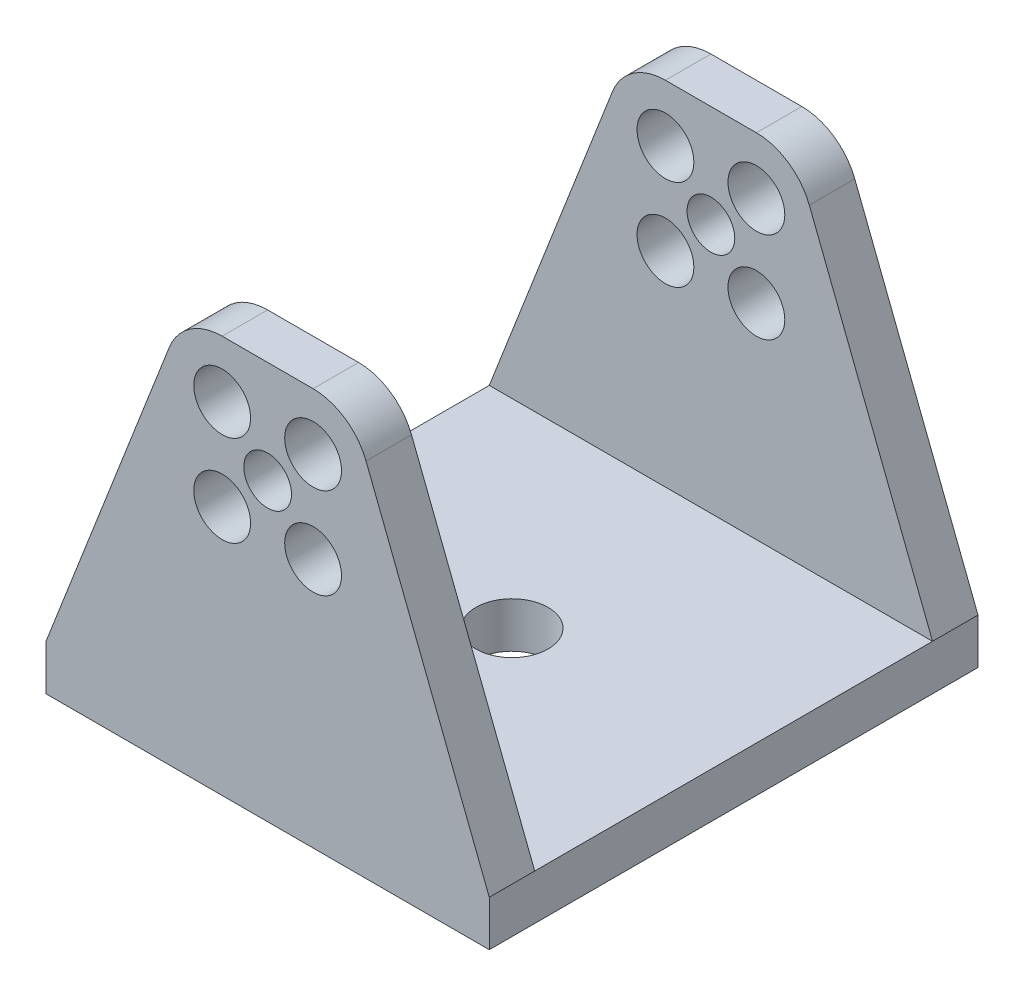
ISO-10303-21;
HEADER;
FILE_DESCRIPTION(('STEP AP214'),'2;1');
FILE_NAME('part.step','',(''),(''),'','','');
FILE_SCHEMA(('AUTOMOTIVE_DESIGN { 1 0 10303 214 1 1 1 1 }'));
ENDSEC;
DATA;
#1=APPLICATION_CONTEXT('core data for automotive mechanical design processes');
#2=APPLICATION_PROTOCOL_DEFINITION('international standard','automotive_design',2000,#1);
#3=PRODUCT_CONTEXT('',#1,'mechanical');
#4=PRODUCT('Part','Part','',(#3));
#5=PRODUCT_RELATED_PRODUCT_CATEGORY('part','',(#4));
#6=PRODUCT_DEFINITION_FORMATION('','',#4);
#7=PRODUCT_DEFINITION_CONTEXT('part definition',#1,'design');
#8=PRODUCT_DEFINITION('design','',#6,#7);
#9=PRODUCT_DEFINITION_SHAPE('','',#8);
#10=(LENGTH_UNIT() NAMED_UNIT(*) SI_UNIT(.MILLI.,.METRE.));
#11=(NAMED_UNIT(*) PLANE_ANGLE_UNIT() SI_UNIT($,.RADIAN.));
#12=(NAMED_UNIT(*) SI_UNIT($,.STERADIAN.) SOLID_ANGLE_UNIT());
#13=UNCERTAINTY_MEASURE_WITH_UNIT(LENGTH_MEASURE(1.E-05),#10,'distance_accuracy_value','');
#14=(GEOMETRIC_REPRESENTATION_CONTEXT(3) GLOBAL_UNCERTAINTY_ASSIGNED_CONTEXT((#13)) GLOBAL_UNIT_ASSIGNED_CONTEXT((#10,
#11,#12)) REPRESENTATION_CONTEXT('',''));
#15=CARTESIAN_POINT('',(0.,0.,0.));
#16=DIRECTION('',(0.,0.,1.));
#17=DIRECTION('',(1.,0.,0.));
#18=AXIS2_PLACEMENT_3D('',#15,#16,#17);
#19=CARTESIAN_POINT('',(23.5,30.,56.8196748283246));
#20=DIRECTION('',(0.,0.,-1.));
#21=DIRECTION('',(-1.,0.,0.));
#22=AXIS2_PLACEMENT_3D('',#19,#20,#21);
#23=CYLINDRICAL_SURFACE('',#22,5.);
#24=CARTESIAN_POINT('',(23.5,30.,-32.));
#25=DIRECTION('',(0.,0.,1.));
#26=DIRECTION('',(1.,0.,0.));
#27=AXIS2_PLACEMENT_3D('',#24,#25,#26);
#28=CIRCLE('',#27,5.);
#29=CARTESIAN_POINT('',(28.1586579667311,31.8157384032435,-32.));
#30=VERTEX_POINT('',#29);
#31=CARTESIAN_POINT('',(23.5,35.,-32.));
#32=VERTEX_POINT('',#31);
#33=EDGE_CURVE('E173',#30,#32,#28,.T.);
#34=ORIENTED_EDGE('',*,*,#33,.F.);
#35=DIRECTION('',(0.,0.,-1.));
#36=VECTOR('',#35,1.);
#37=CARTESIAN_POINT('',(28.1586579667311,31.8157384032435,56.8196748283246));
#38=LINE('',#37,#36);
#39=CARTESIAN_POINT('',(28.1586579667311,31.8157384032435,-36.));
#40=VERTEX_POINT('',#39);
#41=EDGE_CURVE('E172',#30,#40,#38,.T.);
#42=ORIENTED_EDGE('',*,*,#41,.T.);
#43=CARTESIAN_POINT('',(23.5,30.,-36.));
#44=DIRECTION('',(0.,0.,1.));
#45=DIRECTION('',(1.,0.,0.));
#46=AXIS2_PLACEMENT_3D('',#43,#44,#45);
#47=CIRCLE('',#46,5.);
#48=CARTESIAN_POINT('',(23.5,35.,-36.));
#49=VERTEX_POINT('',#48);
#50=EDGE_CURVE('E264',#49,#40,#47,.F.);
#51=ORIENTED_EDGE('',*,*,#50,.F.);
#52=DIRECTION('',(0.,0.,-1.));
#53=VECTOR('',#52,1.);
#54=CARTESIAN_POINT('',(23.5,35.,56.8196748283246));
#55=LINE('',#54,#53);
#56=EDGE_CURVE('E281',#32,#49,#55,.T.);
#57=ORIENTED_EDGE('',*,*,#56,.F.);
#58=EDGE_LOOP('',(#34,#42,#51,#57));
#59=FACE_BOUND('',#58,.T.);
#60=ADVANCED_FACE('F37',(#59),#23,.T.);
#61=CARTESIAN_POINT('',(23.5,30.,3.));
#62=DIRECTION('',(0.,0.,-1.));
#63=DIRECTION('',(-1.,0.,0.));
#64=AXIS2_PLACEMENT_3D('',#61,#62,#63);
#65=CIRCLE('',#64,5.);
#66=CARTESIAN_POINT('',(23.5,35.,3.));
#67=VERTEX_POINT('',#66);
#68=CARTESIAN_POINT('',(28.1586579667311,31.8157384032435,3.));
#69=VERTEX_POINT('',#68);
#70=EDGE_CURVE('E221',#67,#69,#65,.T.);
#71=ORIENTED_EDGE('',*,*,#70,.F.);
#72=CARTESIAN_POINT('',(23.5,35.,7.));
#73=VERTEX_POINT('',#72);
#74=EDGE_CURVE('E277',#73,#67,#55,.T.);
#75=ORIENTED_EDGE('',*,*,#74,.F.);
#76=CARTESIAN_POINT('',(23.5,30.,7.));
#77=DIRECTION('',(0.,0.,-1.));
#78=DIRECTION('',(-1.,0.,0.));
#79=AXIS2_PLACEMENT_3D('',#76,#77,#78);
#80=CIRCLE('',#79,5.);
#81=CARTESIAN_POINT('',(28.1586579667311,31.8157384032435,7.));
#82=VERTEX_POINT('',#81);
#83=EDGE_CURVE('E261',#73,#82,#80,.T.);
#84=ORIENTED_EDGE('',*,*,#83,.T.);
#85=EDGE_CURVE('E292',#82,#69,#38,.T.);
#86=ORIENTED_EDGE('',*,*,#85,.T.);
#87=EDGE_LOOP('',(#71,#75,#84,#86));
#88=FACE_BOUND('',#87,.T.);
#89=ADVANCED_FACE('F342',(#88),#23,.T.);
#90=CARTESIAN_POINT('',(23.5,35.,56.8196748283246));
#91=DIRECTION('',(0.,-1.,0.));
#92=DIRECTION('',(0.,0.,-1.));
#93=AXIS2_PLACEMENT_3D('',#90,#91,#92);
#94=PLANE('',#93);
#95=DIRECTION('',(-1.,0.,0.));
#96=VECTOR('',#95,1.);
#97=CARTESIAN_POINT('',(23.5,35.,-32.));
#98=LINE('',#97,#96);
#99=CARTESIAN_POINT('',(15.5,35.,-32.));
#100=VERTEX_POINT('',#99);
#101=EDGE_CURVE('E241',#32,#100,#98,.T.);
#102=ORIENTED_EDGE('',*,*,#101,.F.);
#103=ORIENTED_EDGE('',*,*,#56,.T.);
#104=DIRECTION('',(1.,0.,0.));
#105=VECTOR('',#104,1.);
#106=CARTESIAN_POINT('',(23.5,35.,-36.));
#107=LINE('',#106,#105);
#108=CARTESIAN_POINT('',(15.5,35.,-36.));
#109=VERTEX_POINT('',#108);
#110=EDGE_CURVE('E258',#109,#49,#107,.T.);
#111=ORIENTED_EDGE('',*,*,#110,.F.);
#112=DIRECTION('',(0.,0.,-1.));
#113=VECTOR('',#112,1.);
#114=CARTESIAN_POINT('',(15.5,35.,56.8196748283246));
#115=LINE('',#114,#113);
#116=EDGE_CURVE('E286',#100,#109,#115,.T.);
#117=ORIENTED_EDGE('',*,*,#116,.F.);
#118=EDGE_LOOP('',(#102,#103,#111,#117));
#119=FACE_BOUND('',#118,.T.);
#120=ADVANCED_FACE('F348',(#119),#94,.F.);
#121=DIRECTION('',(1.,0.,0.));
#122=VECTOR('',#121,1.);
#123=CARTESIAN_POINT('',(23.5,35.,3.));
#124=LINE('',#123,#122);
#125=CARTESIAN_POINT('',(15.5,35.,3.));
#126=VERTEX_POINT('',#125);
#127=EDGE_CURVE('E223',#126,#67,#124,.T.);
#128=ORIENTED_EDGE('',*,*,#127,.F.);
#129=CARTESIAN_POINT('',(15.5,35.,7.));
#130=VERTEX_POINT('',#129);
#131=EDGE_CURVE('E282',#130,#126,#115,.T.);
#132=ORIENTED_EDGE('',*,*,#131,.F.);
#133=DIRECTION('',(1.,0.,0.));
#134=VECTOR('',#133,1.);
#135=CARTESIAN_POINT('',(23.5,35.,7.));
#136=LINE('',#135,#134);
#137=EDGE_CURVE('E295',#130,#73,#136,.T.);
#138=ORIENTED_EDGE('',*,*,#137,.T.);
#139=ORIENTED_EDGE('',*,*,#74,.T.);
#140=EDGE_LOOP('',(#128,#132,#138,#139));
#141=FACE_BOUND('',#140,.T.);
#142=ADVANCED_FACE('F410',(#141),#94,.F.);
#143=CARTESIAN_POINT('',(15.5,30.,56.8196748283246));
#144=DIRECTION('',(0.,0.,-1.));
#145=DIRECTION('',(-1.,0.,0.));
#146=AXIS2_PLACEMENT_3D('',#143,#144,#145);
#147=CYLINDRICAL_SURFACE('',#146,5.);
#148=CARTESIAN_POINT('',(15.5,30.,-32.));
#149=DIRECTION('',(0.,0.,1.));
#150=DIRECTION('',(1.,0.,0.));
#151=AXIS2_PLACEMENT_3D('',#148,#149,#150);
#152=CIRCLE('',#151,5.);
#153=CARTESIAN_POINT('',(10.841342033269,31.8157384032435,-32.));
#154=VERTEX_POINT('',#153);
#155=EDGE_CURVE('E243',#100,#154,#152,.T.);
#156=ORIENTED_EDGE('',*,*,#155,.F.);
#157=ORIENTED_EDGE('',*,*,#116,.T.);
#158=CARTESIAN_POINT('',(15.5,30.,-36.));
#159=DIRECTION('',(0.,0.,1.));
#160=DIRECTION('',(1.,0.,0.));
#161=AXIS2_PLACEMENT_3D('',#158,#159,#160);
#162=CIRCLE('',#161,5.);
#163=CARTESIAN_POINT('',(10.841342033269,31.8157384032435,-36.));
#164=VERTEX_POINT('',#163);
#165=EDGE_CURVE('E265',#164,#109,#162,.F.);
#166=ORIENTED_EDGE('',*,*,#165,.F.);
#167=DIRECTION('',(0.,0.,-1.));
#168=VECTOR('',#167,1.);
#169=CARTESIAN_POINT('',(10.841342033269,31.8157384032435,56.8196748283246));
#170=LINE('',#169,#168);
#171=EDGE_CURVE('E291',#154,#164,#170,.T.);
#172=ORIENTED_EDGE('',*,*,#171,.F.);
#173=EDGE_LOOP('',(#156,#157,#166,#172));
#174=FACE_BOUND('',#173,.T.);
#175=ADVANCED_FACE('F408',(#174),#147,.T.);
#176=CARTESIAN_POINT('',(15.5,30.,3.));
#177=DIRECTION('',(0.,0.,-1.));
#178=DIRECTION('',(-1.,0.,0.));
#179=AXIS2_PLACEMENT_3D('',#176,#177,#178);
#180=CIRCLE('',#179,5.);
#181=CARTESIAN_POINT('',(10.841342033269,31.8157384032435,3.));
#182=VERTEX_POINT('',#181);
#183=EDGE_CURVE('E225',#182,#126,#180,.T.);
#184=ORIENTED_EDGE('',*,*,#183,.F.);
#185=CARTESIAN_POINT('',(10.841342033269,31.8157384032435,7.));
#186=VERTEX_POINT('',#185);
#187=EDGE_CURVE('E287',#186,#182,#170,.T.);
#188=ORIENTED_EDGE('',*,*,#187,.F.);
#189=CARTESIAN_POINT('',(15.5,30.,7.));
#190=DIRECTION('',(0.,0.,-1.));
#191=DIRECTION('',(-1.,0.,0.));
#192=AXIS2_PLACEMENT_3D('',#189,#190,#191);
#193=CIRCLE('',#192,5.);
#194=EDGE_CURVE('E280',#186,#130,#193,.T.);
#195=ORIENTED_EDGE('',*,*,#194,.T.);
#196=ORIENTED_EDGE('',*,*,#131,.T.);
#197=EDGE_LOOP('',(#184,#188,#195,#196));
#198=FACE_BOUND('',#197,.T.);
#199=ADVANCED_FACE('F406',(#198),#147,.T.);
#200=CARTESIAN_POINT('',(0.,4.,56.8196748283246));
#201=DIRECTION('',(0.93173159334621,-0.363147680648703,0.));
#202=DIRECTION('',(0.363147680648703,0.93173159334621,0.));
#203=AXIS2_PLACEMENT_3D('',#200,#201,#202);
#204=PLANE('',#203);
#205=DIRECTION('',(-0.363147680648703,-0.93173159334621,0.));
#206=VECTOR('',#205,1.);
#207=CARTESIAN_POINT('',(0.,4.,-32.));
#208=LINE('',#207,#206);
#209=CARTESIAN_POINT('',(0.,4.,-32.));
#210=VERTEX_POINT('',#209);
#211=EDGE_CURVE('E168',#154,#210,#208,.T.);
#212=ORIENTED_EDGE('',*,*,#211,.F.);
#213=ORIENTED_EDGE('',*,*,#171,.T.);
#214=DIRECTION('',(0.363147680648703,0.93173159334621,0.));
#215=VECTOR('',#214,1.);
#216=CARTESIAN_POINT('',(0.,4.,-36.));
#217=LINE('',#216,#215);
#218=CARTESIAN_POINT('',(0.,4.,-36.));
#219=VERTEX_POINT('',#218);
#220=EDGE_CURVE('E268',#219,#164,#217,.T.);
#221=ORIENTED_EDGE('',*,*,#220,.F.);
#222=DIRECTION('',(0.,0.,1.));
#223=VECTOR('',#222,1.);
#224=CARTESIAN_POINT('',(0.,4.,-36.));
#225=LINE('',#224,#223);
#226=EDGE_CURVE('E180',#219,#210,#225,.T.);
#227=ORIENTED_EDGE('',*,*,#226,.T.);
#228=EDGE_LOOP('',(#212,#213,#221,#227));
#229=FACE_BOUND('',#228,.T.);
#230=ADVANCED_FACE('F404',(#229),#204,.F.);
#231=DIRECTION('',(0.363147680648703,0.93173159334621,0.));
#232=VECTOR('',#231,1.);
#233=CARTESIAN_POINT('',(0.,4.,3.));
#234=LINE('',#233,#232);
#235=CARTESIAN_POINT('',(0.,4.,3.));
#236=VERTEX_POINT('',#235);
#237=EDGE_CURVE('E227',#236,#182,#234,.T.);
#238=ORIENTED_EDGE('',*,*,#237,.F.);
#239=CARTESIAN_POINT('',(0.,4.,7.));
#240=VERTEX_POINT('',#239);
#241=EDGE_CURVE('E92',#236,#240,#225,.T.);
#242=ORIENTED_EDGE('',*,*,#241,.T.);
#243=DIRECTION('',(0.363147680648703,0.93173159334621,0.));
#244=VECTOR('',#243,1.);
#245=CARTESIAN_POINT('',(0.,4.,7.));
#246=LINE('',#245,#244);
#247=EDGE_CURVE('E285',#240,#186,#246,.T.);
#248=ORIENTED_EDGE('',*,*,#247,.T.);
#249=ORIENTED_EDGE('',*,*,#187,.T.);
#250=EDGE_LOOP('',(#238,#242,#248,#249));
#251=FACE_BOUND('',#250,.T.);
#252=ADVANCED_FACE('F403',(#251),#204,.F.);
#253=CARTESIAN_POINT('',(39.,4.,56.8196748283246));
#254=DIRECTION('',(-0.93173159334621,-0.363147680648702,0.));
#255=DIRECTION('',(0.363147680648703,-0.93173159334621,0.));
#256=AXIS2_PLACEMENT_3D('',#253,#254,#255);
#257=PLANE('',#256);
#258=DIRECTION('',(-0.363147680648703,0.93173159334621,0.));
#259=VECTOR('',#258,1.);
#260=CARTESIAN_POINT('',(39.,4.,-32.));
#261=LINE('',#260,#259);
#262=CARTESIAN_POINT('',(39.,4.,-32.));
#263=VERTEX_POINT('',#262);
#264=EDGE_CURVE('E165',#263,#30,#261,.T.);
#265=ORIENTED_EDGE('',*,*,#264,.F.);
#266=DIRECTION('',(0.,0.,-1.));
#267=VECTOR('',#266,1.);
#268=CARTESIAN_POINT('',(39.,4.,-36.));
#269=LINE('',#268,#267);
#270=CARTESIAN_POINT('',(39.,4.,-36.));
#271=VERTEX_POINT('',#270);
#272=EDGE_CURVE('E63',#263,#271,#269,.T.);
#273=ORIENTED_EDGE('',*,*,#272,.T.);
#274=DIRECTION('',(0.363147680648702,-0.93173159334621,0.));
#275=VECTOR('',#274,1.);
#276=CARTESIAN_POINT('',(39.,4.,-36.));
#277=LINE('',#276,#275);
#278=EDGE_CURVE('E271',#40,#271,#277,.T.);
#279=ORIENTED_EDGE('',*,*,#278,.F.);
#280=ORIENTED_EDGE('',*,*,#41,.F.);
#281=EDGE_LOOP('',(#265,#273,#279,#280));
#282=FACE_BOUND('',#281,.T.);
#283=ADVANCED_FACE('F171',(#282),#257,.F.);
#284=DIRECTION('',(0.363147680648703,-0.93173159334621,0.));
#285=VECTOR('',#284,1.);
#286=CARTESIAN_POINT('',(39.,4.,3.));
#287=LINE('',#286,#285);
#288=CARTESIAN_POINT('',(39.,4.,3.));
#289=VERTEX_POINT('',#288);
#290=EDGE_CURVE('E219',#69,#289,#287,.T.);
#291=ORIENTED_EDGE('',*,*,#290,.F.);
#292=ORIENTED_EDGE('',*,*,#85,.F.);
#293=DIRECTION('',(0.363147680648703,-0.93173159334621,0.));
#294=VECTOR('',#293,1.);
#295=CARTESIAN_POINT('',(39.,4.,7.));
#296=LINE('',#295,#294);
#297=CARTESIAN_POINT('',(39.,4.,7.));
#298=VERTEX_POINT('',#297);
#299=EDGE_CURVE('E290',#82,#298,#296,.T.);
#300=ORIENTED_EDGE('',*,*,#299,.T.);
#301=EDGE_CURVE('E179',#298,#289,#269,.T.);
#302=ORIENTED_EDGE('',*,*,#301,.T.);
#303=EDGE_LOOP('',(#291,#292,#300,#302));
#304=FACE_BOUND('',#303,.T.);
#305=ADVANCED_FACE('F389',(#304),#257,.F.);
#306=CARTESIAN_POINT('',(15.5,30.,56.8196748283246));
#307=DIRECTION('',(0.,0.,-1.));
#308=DIRECTION('',(-1.,0.,0.));
#309=AXIS2_PLACEMENT_3D('',#306,#307,#308);
#310=CYLINDRICAL_SURFACE('',#309,2.5);
#311=CARTESIAN_POINT('',(15.5,30.,-36.));
#312=DIRECTION('',(0.,0.,1.));
#313=DIRECTION('',(1.,0.,0.));
#314=AXIS2_PLACEMENT_3D('',#311,#312,#313);
#315=CIRCLE('',#314,2.5);
#316=CARTESIAN_POINT('',(18.,30.,-36.));
#317=VERTEX_POINT('',#316);
#318=EDGE_CURVE('E255',#317,#317,#315,.F.);
#319=ORIENTED_EDGE('',*,*,#318,.T.);
#320=EDGE_LOOP('',(#319));
#321=FACE_BOUND('',#320,.T.);
#322=CARTESIAN_POINT('',(15.5,30.,-32.));
#323=DIRECTION('',(0.,0.,1.));
#324=DIRECTION('',(1.,0.,0.));
#325=AXIS2_PLACEMENT_3D('',#322,#323,#324);
#326=CIRCLE('',#325,2.5);
#327=CARTESIAN_POINT('',(18.,30.,-32.));
#328=VERTEX_POINT('',#327);
#329=EDGE_CURVE('E174',#328,#328,#326,.T.);
#330=ORIENTED_EDGE('',*,*,#329,.T.);
#331=EDGE_LOOP('',(#330));
#332=FACE_BOUND('',#331,.T.);
#333=ADVANCED_FACE('F387',(#321,#332),#310,.F.);
#334=CARTESIAN_POINT('',(15.5,30.,7.));
#335=DIRECTION('',(0.,0.,-1.));
#336=DIRECTION('',(-1.,0.,0.));
#337=AXIS2_PLACEMENT_3D('',#334,#335,#336);
#338=CIRCLE('',#337,2.5);
#339=CARTESIAN_POINT('',(13.,30.,7.));
#340=VERTEX_POINT('',#339);
#341=EDGE_CURVE('E306',#340,#340,#338,.T.);
#342=ORIENTED_EDGE('',*,*,#341,.F.);
#343=EDGE_LOOP('',(#342));
#344=FACE_BOUND('',#343,.T.);
#345=CARTESIAN_POINT('',(15.5,30.,3.));
#346=DIRECTION('',(0.,0.,-1.));
#347=DIRECTION('',(-1.,0.,0.));
#348=AXIS2_PLACEMENT_3D('',#345,#346,#347);
#349=CIRCLE('',#348,2.5);
#350=CARTESIAN_POINT('',(13.,30.,3.));
#351=VERTEX_POINT('',#350);
#352=EDGE_CURVE('E216',#351,#351,#349,.T.);
#353=ORIENTED_EDGE('',*,*,#352,.T.);
#354=EDGE_LOOP('',(#353));
#355=FACE_BOUND('',#354,.T.);
#356=ADVANCED_FACE('F357',(#344,#355),#310,.F.);
#357=CARTESIAN_POINT('',(19.5,26.,56.8196748283246));
#358=DIRECTION('',(0.,0.,-1.));
#359=DIRECTION('',(-1.,0.,0.));
#360=AXIS2_PLACEMENT_3D('',#357,#358,#359);
#361=CYLINDRICAL_SURFACE('',#360,2.1);
#362=CARTESIAN_POINT('',(19.5,26.,-36.));
#363=DIRECTION('',(0.,0.,1.));
#364=DIRECTION('',(1.,0.,0.));
#365=AXIS2_PLACEMENT_3D('',#362,#363,#364);
#366=CIRCLE('',#365,2.1);
#367=CARTESIAN_POINT('',(21.6,26.,-36.));
#368=VERTEX_POINT('',#367);
#369=EDGE_CURVE('E251',#368,#368,#366,.F.);
#370=ORIENTED_EDGE('',*,*,#369,.T.);
#371=EDGE_LOOP('',(#370));
#372=FACE_BOUND('',#371,.T.);
#373=CARTESIAN_POINT('',(19.5,26.,-32.));
#374=DIRECTION('',(0.,0.,1.));
#375=DIRECTION('',(1.,0.,0.));
#376=AXIS2_PLACEMENT_3D('',#373,#374,#375);
#377=CIRCLE('',#376,2.1);
#378=CARTESIAN_POINT('',(21.6,26.,-32.));
#379=VERTEX_POINT('',#378);
#380=EDGE_CURVE('E235',#379,#379,#377,.T.);
#381=ORIENTED_EDGE('',*,*,#380,.T.);
#382=EDGE_LOOP('',(#381));
#383=FACE_BOUND('',#382,.T.);
#384=ADVANCED_FACE('F353',(#372,#383),#361,.F.);
#385=CARTESIAN_POINT('',(19.5,26.,7.));
#386=DIRECTION('',(0.,0.,-1.));
#387=DIRECTION('',(-1.,0.,0.));
#388=AXIS2_PLACEMENT_3D('',#385,#386,#387);
#389=CIRCLE('',#388,2.1);
#390=CARTESIAN_POINT('',(17.4,26.,7.));
#391=VERTEX_POINT('',#390);
#392=EDGE_CURVE('E309',#391,#391,#389,.T.);
#393=ORIENTED_EDGE('',*,*,#392,.F.);
#394=EDGE_LOOP('',(#393));
#395=FACE_BOUND('',#394,.T.);
#396=CARTESIAN_POINT('',(19.5,26.,3.));
#397=DIRECTION('',(0.,0.,-1.));
#398=DIRECTION('',(-1.,0.,0.));
#399=AXIS2_PLACEMENT_3D('',#396,#397,#398);
#400=CIRCLE('',#399,2.1);
#401=CARTESIAN_POINT('',(17.4,26.,3.));
#402=VERTEX_POINT('',#401);
#403=EDGE_CURVE('E213',#402,#402,#400,.T.);
#404=ORIENTED_EDGE('',*,*,#403,.T.);
#405=EDGE_LOOP('',(#404));
#406=FACE_BOUND('',#405,.T.);
#407=ADVANCED_FACE('F356',(#395,#406),#361,.F.);
#408=CARTESIAN_POINT('',(23.5,30.,56.8196748283246));
#409=DIRECTION('',(0.,0.,-1.));
#410=DIRECTION('',(-1.,0.,0.));
#411=AXIS2_PLACEMENT_3D('',#408,#409,#410);
#412=CYLINDRICAL_SURFACE('',#411,2.5);
#413=CARTESIAN_POINT('',(23.5,30.,-36.));
#414=DIRECTION('',(0.,0.,1.));
#415=DIRECTION('',(1.,0.,0.));
#416=AXIS2_PLACEMENT_3D('',#413,#414,#415);
#417=CIRCLE('',#416,2.5);
#418=CARTESIAN_POINT('',(26.,30.,-36.));
#419=VERTEX_POINT('',#418);
#420=EDGE_CURVE('E252',#419,#419,#417,.F.);
#421=ORIENTED_EDGE('',*,*,#420,.T.);
#422=EDGE_LOOP('',(#421));
#423=FACE_BOUND('',#422,.T.);
#424=CARTESIAN_POINT('',(23.5,30.,-32.));
#425=DIRECTION('',(0.,0.,1.));
#426=DIRECTION('',(1.,0.,0.));
#427=AXIS2_PLACEMENT_3D('',#424,#425,#426);
#428=CIRCLE('',#427,2.5);
#429=CARTESIAN_POINT('',(26.,30.,-32.));
#430=VERTEX_POINT('',#429);
#431=EDGE_CURVE('E232',#430,#430,#428,.T.);
#432=ORIENTED_EDGE('',*,*,#431,.T.);
#433=EDGE_LOOP('',(#432));
#434=FACE_BOUND('',#433,.T.);
#435=ADVANCED_FACE('F400',(#423,#434),#412,.F.);
#436=CARTESIAN_POINT('',(23.5,30.,7.));
#437=DIRECTION('',(0.,0.,-1.));
#438=DIRECTION('',(-1.,0.,0.));
#439=AXIS2_PLACEMENT_3D('',#436,#437,#438);
#440=CIRCLE('',#439,2.5);
#441=CARTESIAN_POINT('',(21.,30.,7.));
#442=VERTEX_POINT('',#441);
#443=EDGE_CURVE('E312',#442,#442,#440,.T.);
#444=ORIENTED_EDGE('',*,*,#443,.F.);
#445=EDGE_LOOP('',(#444));
#446=FACE_BOUND('',#445,.T.);
#447=CARTESIAN_POINT('',(23.5,30.,3.));
#448=DIRECTION('',(0.,0.,-1.));
#449=DIRECTION('',(-1.,0.,0.));
#450=AXIS2_PLACEMENT_3D('',#447,#448,#449);
#451=CIRCLE('',#450,2.5);
#452=CARTESIAN_POINT('',(21.,30.,3.));
#453=VERTEX_POINT('',#452);
#454=EDGE_CURVE('E205',#453,#453,#451,.T.);
#455=ORIENTED_EDGE('',*,*,#454,.T.);
#456=EDGE_LOOP('',(#455));
#457=FACE_BOUND('',#456,.T.);
#458=ADVANCED_FACE('F362',(#446,#457),#412,.F.);
#459=CARTESIAN_POINT('',(23.5000000000001,22.,56.8196748283246));
#460=DIRECTION('',(0.,0.,-1.));
#461=DIRECTION('',(-1.,0.,0.));
#462=AXIS2_PLACEMENT_3D('',#459,#460,#461);
#463=CYLINDRICAL_SURFACE('',#462,2.5);
#464=CARTESIAN_POINT('',(23.5000000000001,22.,-36.));
#465=DIRECTION('',(0.,0.,1.));
#466=DIRECTION('',(1.,0.,0.));
#467=AXIS2_PLACEMENT_3D('',#464,#465,#466);
#468=CIRCLE('',#467,2.5);
#469=CARTESIAN_POINT('',(26.0000000000001,22.,-36.));
#470=VERTEX_POINT('',#469);
#471=EDGE_CURVE('E247',#470,#470,#468,.F.);
#472=ORIENTED_EDGE('',*,*,#471,.T.);
#473=EDGE_LOOP('',(#472));
#474=FACE_BOUND('',#473,.T.);
#475=CARTESIAN_POINT('',(23.5000000000001,22.,-32.));
#476=DIRECTION('',(0.,0.,1.));
#477=DIRECTION('',(1.,0.,0.));
#478=AXIS2_PLACEMENT_3D('',#475,#476,#477);
#479=CIRCLE('',#478,2.5);
#480=CARTESIAN_POINT('',(26.0000000000001,22.,-32.));
#481=VERTEX_POINT('',#480);
#482=EDGE_CURVE('E229',#481,#481,#479,.T.);
#483=ORIENTED_EDGE('',*,*,#482,.T.);
#484=EDGE_LOOP('',(#483));
#485=FACE_BOUND('',#484,.T.);
#486=ADVANCED_FACE('F359',(#474,#485),#463,.F.);
#487=CARTESIAN_POINT('',(23.5000000000001,22.,7.));
#488=DIRECTION('',(0.,0.,-1.));
#489=DIRECTION('',(-1.,0.,0.));
#490=AXIS2_PLACEMENT_3D('',#487,#488,#489);
#491=CIRCLE('',#490,2.5);
#492=CARTESIAN_POINT('',(21.0000000000001,22.,7.));
#493=VERTEX_POINT('',#492);
#494=EDGE_CURVE('E315',#493,#493,#491,.T.);
#495=ORIENTED_EDGE('',*,*,#494,.F.);
#496=EDGE_LOOP('',(#495));
#497=FACE_BOUND('',#496,.T.);
#498=CARTESIAN_POINT('',(23.5000000000001,22.,3.));
#499=DIRECTION('',(0.,0.,-1.));
#500=DIRECTION('',(-1.,0.,0.));
#501=AXIS2_PLACEMENT_3D('',#498,#499,#500);
#502=CIRCLE('',#501,2.5);
#503=CARTESIAN_POINT('',(21.0000000000001,22.,3.));
#504=VERTEX_POINT('',#503);
#505=EDGE_CURVE('E201',#504,#504,#502,.T.);
#506=ORIENTED_EDGE('',*,*,#505,.T.);
#507=EDGE_LOOP('',(#506));
#508=FACE_BOUND('',#507,.T.);
#509=ADVANCED_FACE('F361',(#497,#508),#463,.F.);
#510=CARTESIAN_POINT('',(15.5000000000001,22.,56.8196748283246));
#511=DIRECTION('',(0.,0.,-1.));
#512=DIRECTION('',(-1.,0.,0.));
#513=AXIS2_PLACEMENT_3D('',#510,#511,#512);
#514=CYLINDRICAL_SURFACE('',#513,2.5);
#515=CARTESIAN_POINT('',(15.5000000000001,22.,-36.));
#516=DIRECTION('',(0.,0.,1.));
#517=DIRECTION('',(1.,0.,0.));
#518=AXIS2_PLACEMENT_3D('',#515,#516,#517);
#519=CIRCLE('',#518,2.5);
#520=CARTESIAN_POINT('',(18.0000000000001,22.,-36.));
#521=VERTEX_POINT('',#520);
#522=EDGE_CURVE('E250',#521,#521,#519,.F.);
#523=ORIENTED_EDGE('',*,*,#522,.T.);
#524=EDGE_LOOP('',(#523));
#525=FACE_BOUND('',#524,.T.);
#526=CARTESIAN_POINT('',(15.5000000000001,22.,-32.));
#527=DIRECTION('',(0.,0.,1.));
#528=DIRECTION('',(1.,0.,0.));
#529=AXIS2_PLACEMENT_3D('',#526,#527,#528);
#530=CIRCLE('',#529,2.5);
#531=CARTESIAN_POINT('',(18.0000000000001,22.,-32.));
#532=VERTEX_POINT('',#531);
#533=EDGE_CURVE('E41',#532,#532,#530,.T.);
#534=ORIENTED_EDGE('',*,*,#533,.T.);
#535=EDGE_LOOP('',(#534));
#536=FACE_BOUND('',#535,.T.);
#537=ADVANCED_FACE('F364',(#525,#536),#514,.F.);
#538=CARTESIAN_POINT('',(15.5000000000001,22.,7.));
#539=DIRECTION('',(0.,0.,-1.));
#540=DIRECTION('',(-1.,0.,0.));
#541=AXIS2_PLACEMENT_3D('',#538,#539,#540);
#542=CIRCLE('',#541,2.5);
#543=CARTESIAN_POINT('',(13.0000000000001,22.,7.));
#544=VERTEX_POINT('',#543);
#545=EDGE_CURVE('E305',#544,#544,#542,.T.);
#546=ORIENTED_EDGE('',*,*,#545,.F.);
#547=EDGE_LOOP('',(#546));
#548=FACE_BOUND('',#547,.T.);
#549=CARTESIAN_POINT('',(15.5000000000001,22.,3.));
#550=DIRECTION('',(0.,0.,-1.));
#551=DIRECTION('',(-1.,0.,0.));
#552=AXIS2_PLACEMENT_3D('',#549,#550,#551);
#553=CIRCLE('',#552,2.5);
#554=CARTESIAN_POINT('',(13.0000000000001,22.,3.));
#555=VERTEX_POINT('',#554);
#556=EDGE_CURVE('E199',#555,#555,#553,.T.);
#557=ORIENTED_EDGE('',*,*,#556,.T.);
#558=EDGE_LOOP('',(#557));
#559=FACE_BOUND('',#558,.T.);
#560=ADVANCED_FACE('F366',(#548,#559),#514,.F.);
#561=CARTESIAN_POINT('',(0.,0.,0.));
#562=DIRECTION('',(0.,1.,0.));
#563=DIRECTION('',(0.,0.,1.));
#564=AXIS2_PLACEMENT_3D('',#561,#562,#563);
#565=PLANE('',#564);
#566=DIRECTION('',(0.,0.,1.));
#567=VECTOR('',#566,1.);
#568=CARTESIAN_POINT('',(0.,0.,-36.));
#569=LINE('',#568,#567);
#570=CARTESIAN_POINT('',(0.,0.,-36.));
#571=VERTEX_POINT('',#570);
#572=CARTESIAN_POINT('',(0.,0.,7.));
#573=VERTEX_POINT('',#572);
#574=EDGE_CURVE('E187',#571,#573,#569,.T.);
#575=ORIENTED_EDGE('',*,*,#574,.F.);
#576=DIRECTION('',(-1.,0.,0.));
#577=VECTOR('',#576,1.);
#578=CARTESIAN_POINT('',(0.,0.,-36.));
#579=LINE('',#578,#577);
#580=CARTESIAN_POINT('',(39.,0.,-36.));
#581=VERTEX_POINT('',#580);
#582=EDGE_CURVE('E85',#581,#571,#579,.T.);
#583=ORIENTED_EDGE('',*,*,#582,.F.);
#584=DIRECTION('',(0.,0.,-1.));
#585=VECTOR('',#584,1.);
#586=CARTESIAN_POINT('',(39.,0.,-36.));
#587=LINE('',#586,#585);
#588=CARTESIAN_POINT('',(39.,0.,7.));
#589=VERTEX_POINT('',#588);
#590=EDGE_CURVE('E193',#589,#581,#587,.T.);
#591=ORIENTED_EDGE('',*,*,#590,.F.);
#592=DIRECTION('',(1.,0.,0.));
#593=VECTOR('',#592,1.);
#594=CARTESIAN_POINT('',(0.,0.,7.));
#595=LINE('',#594,#593);
#596=EDGE_CURVE('E190',#573,#589,#595,.T.);
#597=ORIENTED_EDGE('',*,*,#596,.F.);
#598=EDGE_LOOP('',(#575,#583,#591,#597));
#599=FACE_BOUND('',#598,.T.);
#600=CARTESIAN_POINT('',(19.5,0.,-14.5));
#601=DIRECTION('',(0.,1.,0.));
#602=DIRECTION('',(0.,0.,1.));
#603=AXIS2_PLACEMENT_3D('',#600,#601,#602);
#604=CIRCLE('',#603,3.175);
#605=CARTESIAN_POINT('',(19.5,0.,-11.325));
#606=VERTEX_POINT('',#605);
#607=EDGE_CURVE('E191',#606,#606,#604,.T.);
#608=ORIENTED_EDGE('',*,*,#607,.T.);
#609=EDGE_LOOP('',(#608));
#610=FACE_BOUND('',#609,.T.);
#611=ADVANCED_FACE('F324',(#599,#610),#565,.F.);
#612=CARTESIAN_POINT('',(0.,4.,-36.));
#613=DIRECTION('',(1.,0.,0.));
#614=DIRECTION('',(0.,0.,-1.));
#615=AXIS2_PLACEMENT_3D('',#612,#613,#614);
#616=PLANE('',#615);
#617=ORIENTED_EDGE('',*,*,#574,.T.);
#618=DIRECTION('',(0.,-1.,0.));
#619=VECTOR('',#618,1.);
#620=CARTESIAN_POINT('',(0.,4.,7.));
#621=LINE('',#620,#619);
#622=EDGE_CURVE('E11',#240,#573,#621,.T.);
#623=ORIENTED_EDGE('',*,*,#622,.F.);
#624=ORIENTED_EDGE('',*,*,#241,.F.);
#625=DIRECTION('',(0.,0.,-1.));
#626=VECTOR('',#625,1.);
#627=CARTESIAN_POINT('',(0.,4.,-32.));
#628=LINE('',#627,#626);
#629=EDGE_CURVE('E161',#236,#210,#628,.T.);
#630=ORIENTED_EDGE('',*,*,#629,.T.);
#631=ORIENTED_EDGE('',*,*,#226,.F.);
#632=DIRECTION('',(0.,-1.,0.));
#633=VECTOR('',#632,1.);
#634=CARTESIAN_POINT('',(0.,4.,-36.));
#635=LINE('',#634,#633);
#636=EDGE_CURVE('E182',#219,#571,#635,.T.);
#637=ORIENTED_EDGE('',*,*,#636,.T.);
#638=EDGE_LOOP('',(#617,#623,#624,#630,#631,#637));
#639=FACE_BOUND('',#638,.T.);
#640=ADVANCED_FACE('F39',(#639),#616,.F.);
#641=CARTESIAN_POINT('',(0.,4.,7.));
#642=DIRECTION('',(0.,0.,-1.));
#643=DIRECTION('',(-1.,0.,0.));
#644=AXIS2_PLACEMENT_3D('',#641,#642,#643);
#645=PLANE('',#644);
#646=ORIENTED_EDGE('',*,*,#596,.T.);
#647=DIRECTION('',(0.,-1.,0.));
#648=VECTOR('',#647,1.);
#649=CARTESIAN_POINT('',(39.,4.,7.));
#650=LINE('',#649,#648);
#651=EDGE_CURVE('E46',#298,#589,#650,.T.);
#652=ORIENTED_EDGE('',*,*,#651,.F.);
#653=ORIENTED_EDGE('',*,*,#299,.F.);
#654=ORIENTED_EDGE('',*,*,#83,.F.);
#655=ORIENTED_EDGE('',*,*,#137,.F.);
#656=ORIENTED_EDGE('',*,*,#194,.F.);
#657=ORIENTED_EDGE('',*,*,#247,.F.);
#658=ORIENTED_EDGE('',*,*,#622,.T.);
#659=EDGE_LOOP('',(#646,#652,#653,#654,#655,#656,#657,#658));
#660=FACE_BOUND('',#659,.T.);
#661=ORIENTED_EDGE('',*,*,#545,.T.);
#662=EDGE_LOOP('',(#661));
#663=FACE_BOUND('',#662,.T.);
#664=ORIENTED_EDGE('',*,*,#494,.T.);
#665=EDGE_LOOP('',(#664));
#666=FACE_BOUND('',#665,.T.);
#667=ORIENTED_EDGE('',*,*,#443,.T.);
#668=EDGE_LOOP('',(#667));
#669=FACE_BOUND('',#668,.T.);
#670=ORIENTED_EDGE('',*,*,#392,.T.);
#671=EDGE_LOOP('',(#670));
#672=FACE_BOUND('',#671,.T.);
#673=ORIENTED_EDGE('',*,*,#341,.T.);
#674=EDGE_LOOP('',(#673));
#675=FACE_BOUND('',#674,.T.);
#676=ADVANCED_FACE('F443',(#660,#663,#666,#669,#672,#675),#645,.F.);
#677=CARTESIAN_POINT('',(39.,4.,-36.));
#678=DIRECTION('',(-1.,0.,0.));
#679=DIRECTION('',(0.,0.,1.));
#680=AXIS2_PLACEMENT_3D('',#677,#678,#679);
#681=PLANE('',#680);
#682=ORIENTED_EDGE('',*,*,#590,.T.);
#683=DIRECTION('',(0.,-1.,0.));
#684=VECTOR('',#683,1.);
#685=CARTESIAN_POINT('',(39.,4.,-36.));
#686=LINE('',#685,#684);
#687=EDGE_CURVE('E177',#271,#581,#686,.T.);
#688=ORIENTED_EDGE('',*,*,#687,.F.);
#689=ORIENTED_EDGE('',*,*,#272,.F.);
#690=DIRECTION('',(0.,0.,-1.));
#691=VECTOR('',#690,1.);
#692=CARTESIAN_POINT('',(39.,4.,-32.));
#693=LINE('',#692,#691);
#694=EDGE_CURVE('E153',#289,#263,#693,.T.);
#695=ORIENTED_EDGE('',*,*,#694,.F.);
#696=ORIENTED_EDGE('',*,*,#301,.F.);
#697=ORIENTED_EDGE('',*,*,#651,.T.);
#698=EDGE_LOOP('',(#682,#688,#689,#695,#696,#697));
#699=FACE_BOUND('',#698,.T.);
#700=ADVANCED_FACE('F176',(#699),#681,.F.);
#701=CARTESIAN_POINT('',(0.,4.,-36.));
#702=DIRECTION('',(0.,0.,1.));
#703=DIRECTION('',(1.,0.,0.));
#704=AXIS2_PLACEMENT_3D('',#701,#702,#703);
#705=PLANE('',#704);
#706=ORIENTED_EDGE('',*,*,#582,.T.);
#707=ORIENTED_EDGE('',*,*,#636,.F.);
#708=ORIENTED_EDGE('',*,*,#220,.T.);
#709=ORIENTED_EDGE('',*,*,#165,.T.);
#710=ORIENTED_EDGE('',*,*,#110,.T.);
#711=ORIENTED_EDGE('',*,*,#50,.T.);
#712=ORIENTED_EDGE('',*,*,#278,.T.);
#713=ORIENTED_EDGE('',*,*,#687,.T.);
#714=EDGE_LOOP('',(#706,#707,#708,#709,#710,#711,#712,#713));
#715=FACE_BOUND('',#714,.T.);
#716=ORIENTED_EDGE('',*,*,#369,.F.);
#717=EDGE_LOOP('',(#716));
#718=FACE_BOUND('',#717,.T.);
#719=ORIENTED_EDGE('',*,*,#471,.F.);
#720=EDGE_LOOP('',(#719));
#721=FACE_BOUND('',#720,.T.);
#722=ORIENTED_EDGE('',*,*,#522,.F.);
#723=EDGE_LOOP('',(#722));
#724=FACE_BOUND('',#723,.T.);
#725=ORIENTED_EDGE('',*,*,#420,.F.);
#726=EDGE_LOOP('',(#725));
#727=FACE_BOUND('',#726,.T.);
#728=ORIENTED_EDGE('',*,*,#318,.F.);
#729=EDGE_LOOP('',(#728));
#730=FACE_BOUND('',#729,.T.);
#731=ADVANCED_FACE('F328',(#715,#718,#721,#724,#727,#730),#705,.F.);
#732=CARTESIAN_POINT('',(19.5,4.,-14.5));
#733=DIRECTION('',(0.,-1.,0.));
#734=DIRECTION('',(0.,0.,-1.));
#735=AXIS2_PLACEMENT_3D('',#732,#733,#734);
#736=CYLINDRICAL_SURFACE('',#735,3.175);
#737=CARTESIAN_POINT('',(19.5,4.,-14.5));
#738=DIRECTION('',(0.,1.,0.));
#739=DIRECTION('',(0.,0.,1.));
#740=AXIS2_PLACEMENT_3D('',#737,#738,#739);
#741=CIRCLE('',#740,3.175);
#742=CARTESIAN_POINT('',(19.5,4.,-11.325));
#743=VERTEX_POINT('',#742);
#744=EDGE_CURVE('E246',#743,#743,#741,.T.);
#745=ORIENTED_EDGE('',*,*,#744,.T.);
#746=EDGE_LOOP('',(#745));
#747=FACE_BOUND('',#746,.T.);
#748=ORIENTED_EDGE('',*,*,#607,.F.);
#749=EDGE_LOOP('',(#748));
#750=FACE_BOUND('',#749,.T.);
#751=ADVANCED_FACE('F326',(#747,#750),#736,.F.);
#752=CARTESIAN_POINT('',(39.,4.,-32.));
#753=DIRECTION('',(0.,0.,1.));
#754=DIRECTION('',(1.,0.,0.));
#755=AXIS2_PLACEMENT_3D('',#752,#753,#754);
#756=PLANE('',#755);
#757=ORIENTED_EDGE('',*,*,#533,.F.);
#758=EDGE_LOOP('',(#757));
#759=FACE_BOUND('',#758,.T.);
#760=ORIENTED_EDGE('',*,*,#482,.F.);
#761=EDGE_LOOP('',(#760));
#762=FACE_BOUND('',#761,.T.);
#763=ORIENTED_EDGE('',*,*,#431,.F.);
#764=EDGE_LOOP('',(#763));
#765=FACE_BOUND('',#764,.T.);
#766=ORIENTED_EDGE('',*,*,#380,.F.);
#767=EDGE_LOOP('',(#766));
#768=FACE_BOUND('',#767,.T.);
#769=ORIENTED_EDGE('',*,*,#329,.F.);
#770=EDGE_LOOP('',(#769));
#771=FACE_BOUND('',#770,.T.);
#772=ORIENTED_EDGE('',*,*,#211,.T.);
#773=DIRECTION('',(-1.,0.,0.));
#774=VECTOR('',#773,1.);
#775=CARTESIAN_POINT('',(39.,4.,-32.));
#776=LINE('',#775,#774);
#777=EDGE_CURVE('E156',#263,#210,#776,.T.);
#778=ORIENTED_EDGE('',*,*,#777,.F.);
#779=ORIENTED_EDGE('',*,*,#264,.T.);
#780=ORIENTED_EDGE('',*,*,#33,.T.);
#781=ORIENTED_EDGE('',*,*,#101,.T.);
#782=ORIENTED_EDGE('',*,*,#155,.T.);
#783=EDGE_LOOP('',(#772,#778,#779,#780,#781,#782));
#784=FACE_BOUND('',#783,.T.);
#785=ADVANCED_FACE('F164',(#759,#762,#765,#768,#771,#784),#756,.T.);
#786=CARTESIAN_POINT('',(39.,4.,3.));
#787=DIRECTION('',(0.,0.,-1.));
#788=DIRECTION('',(-1.,0.,0.));
#789=AXIS2_PLACEMENT_3D('',#786,#787,#788);
#790=PLANE('',#789);
#791=ORIENTED_EDGE('',*,*,#556,.F.);
#792=EDGE_LOOP('',(#791));
#793=FACE_BOUND('',#792,.T.);
#794=ORIENTED_EDGE('',*,*,#505,.F.);
#795=EDGE_LOOP('',(#794));
#796=FACE_BOUND('',#795,.T.);
#797=ORIENTED_EDGE('',*,*,#454,.F.);
#798=EDGE_LOOP('',(#797));
#799=FACE_BOUND('',#798,.T.);
#800=ORIENTED_EDGE('',*,*,#403,.F.);
#801=EDGE_LOOP('',(#800));
#802=FACE_BOUND('',#801,.T.);
#803=ORIENTED_EDGE('',*,*,#352,.F.);
#804=EDGE_LOOP('',(#803));
#805=FACE_BOUND('',#804,.T.);
#806=ORIENTED_EDGE('',*,*,#237,.T.);
#807=ORIENTED_EDGE('',*,*,#183,.T.);
#808=ORIENTED_EDGE('',*,*,#127,.T.);
#809=ORIENTED_EDGE('',*,*,#70,.T.);
#810=ORIENTED_EDGE('',*,*,#290,.T.);
#811=DIRECTION('',(-1.,0.,0.));
#812=VECTOR('',#811,1.);
#813=CARTESIAN_POINT('',(39.,4.,3.));
#814=LINE('',#813,#812);
#815=EDGE_CURVE('E54',#289,#236,#814,.T.);
#816=ORIENTED_EDGE('',*,*,#815,.T.);
#817=EDGE_LOOP('',(#806,#807,#808,#809,#810,#816));
#818=FACE_BOUND('',#817,.T.);
#819=ADVANCED_FACE('F335',(#793,#796,#799,#802,#805,#818),#790,.T.);
#820=CARTESIAN_POINT('',(39.,4.,-32.));
#821=DIRECTION('',(0.,1.,0.));
#822=DIRECTION('',(0.,0.,1.));
#823=AXIS2_PLACEMENT_3D('',#820,#821,#822);
#824=PLANE('',#823);
#825=ORIENTED_EDGE('',*,*,#744,.F.);
#826=EDGE_LOOP('',(#825));
#827=FACE_BOUND('',#826,.T.);
#828=ORIENTED_EDGE('',*,*,#629,.F.);
#829=ORIENTED_EDGE('',*,*,#815,.F.);
#830=ORIENTED_EDGE('',*,*,#694,.T.);
#831=ORIENTED_EDGE('',*,*,#777,.T.);
#832=EDGE_LOOP('',(#828,#829,#830,#831));
#833=FACE_BOUND('',#832,.T.);
#834=ADVANCED_FACE('F155',(#827,#833),#824,.T.);
#835=CLOSED_SHELL('',(#60,#89,#120,#142,#175,#199,#230,#252,#283,#305,#333,#356,#384,#407,#435,
#458,#486,#509,#537,#560,#611,#640,#676,#700,#731,#751,#785,#819,#834));
#836=MANIFOLD_SOLID_BREP('B2',#835);
#837=ADVANCED_BREP_SHAPE_REPRESENTATION('',(#18,#836),#14);
#838=SHAPE_DEFINITION_REPRESENTATION(#9,#837);
ENDSEC;
END-ISO-10303-21;
